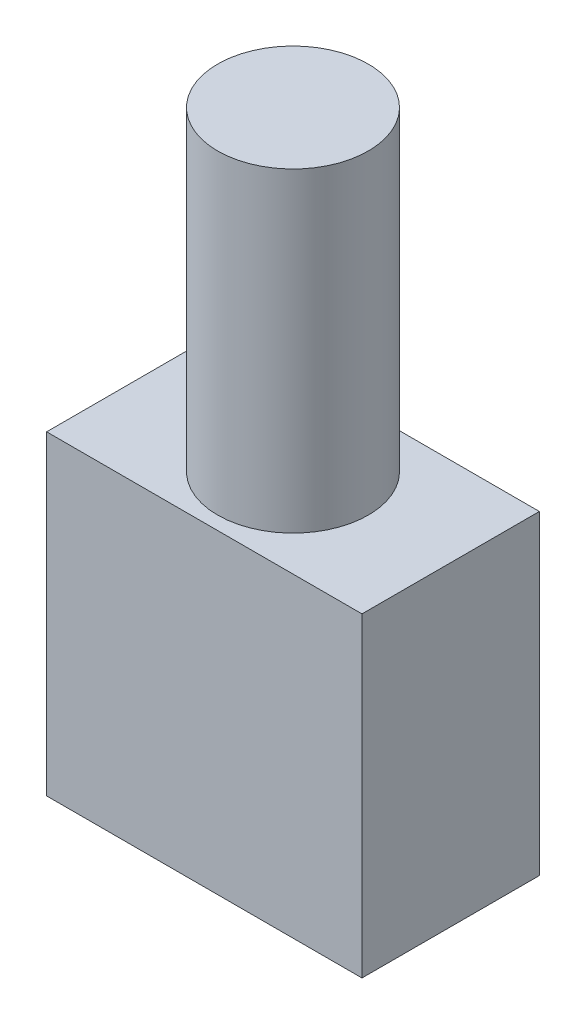
ISO-10303-21;
HEADER;
FILE_DESCRIPTION(('STEP AP214'),'2;1');
FILE_NAME('part.step','',(''),(''),'','','');
FILE_SCHEMA(('AUTOMOTIVE_DESIGN { 1 0 10303 214 1 1 1 1 }'));
ENDSEC;
DATA;
#1=APPLICATION_CONTEXT('core data for automotive mechanical design processes');
#2=APPLICATION_PROTOCOL_DEFINITION('international standard','automotive_design',2000,#1);
#3=PRODUCT_CONTEXT('',#1,'mechanical');
#4=PRODUCT('Part','Part','',(#3));
#5=PRODUCT_RELATED_PRODUCT_CATEGORY('part','',(#4));
#6=PRODUCT_DEFINITION_FORMATION('','',#4);
#7=PRODUCT_DEFINITION_CONTEXT('part definition',#1,'design');
#8=PRODUCT_DEFINITION('design','',#6,#7);
#9=PRODUCT_DEFINITION_SHAPE('','',#8);
#10=(LENGTH_UNIT() NAMED_UNIT(*) SI_UNIT(.MILLI.,.METRE.));
#11=(NAMED_UNIT(*) PLANE_ANGLE_UNIT() SI_UNIT($,.RADIAN.));
#12=(NAMED_UNIT(*) SI_UNIT($,.STERADIAN.) SOLID_ANGLE_UNIT());
#13=UNCERTAINTY_MEASURE_WITH_UNIT(LENGTH_MEASURE(1.E-05),#10,'distance_accuracy_value','');
#14=(GEOMETRIC_REPRESENTATION_CONTEXT(3) GLOBAL_UNCERTAINTY_ASSIGNED_CONTEXT((#13)) GLOBAL_UNIT_ASSIGNED_CONTEXT((#10,
#11,#12)) REPRESENTATION_CONTEXT('',''));
#15=CARTESIAN_POINT('',(0.,0.,0.));
#16=DIRECTION('',(0.,0.,1.));
#17=DIRECTION('',(1.,0.,0.));
#18=AXIS2_PLACEMENT_3D('',#15,#16,#17);
#19=CARTESIAN_POINT('',(-40.,80.,22.5));
#20=DIRECTION('',(0.,0.,-1.));
#21=DIRECTION('',(-1.,0.,0.));
#22=AXIS2_PLACEMENT_3D('',#19,#20,#21);
#23=PLANE('',#22);
#24=DIRECTION('',(1.,0.,0.));
#25=VECTOR('',#24,1.);
#26=CARTESIAN_POINT('',(-40.,0.,22.5));
#27=LINE('',#26,#25);
#28=CARTESIAN_POINT('',(-40.,0.,22.5));
#29=VERTEX_POINT('',#28);
#30=CARTESIAN_POINT('',(40.,0.,22.5));
#31=VERTEX_POINT('',#30);
#32=EDGE_CURVE('E141',#29,#31,#27,.T.);
#33=ORIENTED_EDGE('',*,*,#32,.T.);
#34=DIRECTION('',(0.,-1.,0.));
#35=VECTOR('',#34,1.);
#36=CARTESIAN_POINT('',(40.,80.,22.5));
#37=LINE('',#36,#35);
#38=CARTESIAN_POINT('',(40.,80.,22.5));
#39=VERTEX_POINT('',#38);
#40=EDGE_CURVE('E38',#39,#31,#37,.T.);
#41=ORIENTED_EDGE('',*,*,#40,.F.);
#42=DIRECTION('',(1.,0.,0.));
#43=VECTOR('',#42,1.);
#44=CARTESIAN_POINT('',(-40.,80.,22.5));
#45=LINE('',#44,#43);
#46=CARTESIAN_POINT('',(-40.,80.,22.5));
#47=VERTEX_POINT('',#46);
#48=EDGE_CURVE('E153',#47,#39,#45,.T.);
#49=ORIENTED_EDGE('',*,*,#48,.F.);
#50=DIRECTION('',(0.,-1.,0.));
#51=VECTOR('',#50,1.);
#52=CARTESIAN_POINT('',(-40.,80.,22.5));
#53=LINE('',#52,#51);
#54=EDGE_CURVE('E52',#47,#29,#53,.T.);
#55=ORIENTED_EDGE('',*,*,#54,.T.);
#56=EDGE_LOOP('',(#33,#41,#49,#55));
#57=FACE_BOUND('',#56,.T.);
#58=ADVANCED_FACE('F35',(#57),#23,.F.);
#59=CARTESIAN_POINT('',(40.,80.,22.5));
#60=DIRECTION('',(-1.,0.,0.));
#61=DIRECTION('',(0.,0.,1.));
#62=AXIS2_PLACEMENT_3D('',#59,#60,#61);
#63=PLANE('',#62);
#64=DIRECTION('',(0.,0.,-1.));
#65=VECTOR('',#64,1.);
#66=CARTESIAN_POINT('',(40.,0.,22.5));
#67=LINE('',#66,#65);
#68=CARTESIAN_POINT('',(40.,0.,-22.5));
#69=VERTEX_POINT('',#68);
#70=EDGE_CURVE('E163',#31,#69,#67,.T.);
#71=ORIENTED_EDGE('',*,*,#70,.T.);
#72=DIRECTION('',(0.,-1.,0.));
#73=VECTOR('',#72,1.);
#74=CARTESIAN_POINT('',(40.,80.,-22.5));
#75=LINE('',#74,#73);
#76=CARTESIAN_POINT('',(40.,80.,-22.5));
#77=VERTEX_POINT('',#76);
#78=EDGE_CURVE('E172',#77,#69,#75,.T.);
#79=ORIENTED_EDGE('',*,*,#78,.F.);
#80=DIRECTION('',(0.,0.,-1.));
#81=VECTOR('',#80,1.);
#82=CARTESIAN_POINT('',(40.,80.,22.5));
#83=LINE('',#82,#81);
#84=EDGE_CURVE('E79',#39,#77,#83,.T.);
#85=ORIENTED_EDGE('',*,*,#84,.F.);
#86=ORIENTED_EDGE('',*,*,#40,.T.);
#87=EDGE_LOOP('',(#71,#79,#85,#86));
#88=FACE_BOUND('',#87,.T.);
#89=ADVANCED_FACE('F175',(#88),#63,.F.);
#90=CARTESIAN_POINT('',(-40.,80.,-22.5));
#91=DIRECTION('',(0.,0.,-1.));
#92=DIRECTION('',(-1.,0.,0.));
#93=AXIS2_PLACEMENT_3D('',#90,#91,#92);
#94=PLANE('',#93);
#95=DIRECTION('',(1.,0.,0.));
#96=VECTOR('',#95,1.);
#97=CARTESIAN_POINT('',(-40.,0.,-22.5));
#98=LINE('',#97,#96);
#99=CARTESIAN_POINT('',(-40.,0.,-22.5));
#100=VERTEX_POINT('',#99);
#101=EDGE_CURVE('E166',#100,#69,#98,.T.);
#102=ORIENTED_EDGE('',*,*,#101,.F.);
#103=DIRECTION('',(0.,-1.,0.));
#104=VECTOR('',#103,1.);
#105=CARTESIAN_POINT('',(-40.,80.,-22.5));
#106=LINE('',#105,#104);
#107=CARTESIAN_POINT('',(-40.,80.,-22.5));
#108=VERTEX_POINT('',#107);
#109=EDGE_CURVE('E67',#108,#100,#106,.T.);
#110=ORIENTED_EDGE('',*,*,#109,.F.);
#111=DIRECTION('',(1.,0.,0.));
#112=VECTOR('',#111,1.);
#113=CARTESIAN_POINT('',(-40.,80.,-22.5));
#114=LINE('',#113,#112);
#115=EDGE_CURVE('E157',#108,#77,#114,.T.);
#116=ORIENTED_EDGE('',*,*,#115,.T.);
#117=ORIENTED_EDGE('',*,*,#78,.T.);
#118=EDGE_LOOP('',(#102,#110,#116,#117));
#119=FACE_BOUND('',#118,.T.);
#120=ADVANCED_FACE('F181',(#119),#94,.T.);
#121=CARTESIAN_POINT('',(-40.,80.,22.5));
#122=DIRECTION('',(-1.,0.,0.));
#123=DIRECTION('',(0.,0.,1.));
#124=AXIS2_PLACEMENT_3D('',#121,#122,#123);
#125=PLANE('',#124);
#126=DIRECTION('',(0.,0.,-1.));
#127=VECTOR('',#126,1.);
#128=CARTESIAN_POINT('',(-40.,0.,22.5));
#129=LINE('',#128,#127);
#130=EDGE_CURVE('E155',#29,#100,#129,.T.);
#131=ORIENTED_EDGE('',*,*,#130,.F.);
#132=ORIENTED_EDGE('',*,*,#54,.F.);
#133=DIRECTION('',(0.,0.,-1.));
#134=VECTOR('',#133,1.);
#135=CARTESIAN_POINT('',(-40.,80.,22.5));
#136=LINE('',#135,#134);
#137=EDGE_CURVE('E160',#47,#108,#136,.T.);
#138=ORIENTED_EDGE('',*,*,#137,.T.);
#139=ORIENTED_EDGE('',*,*,#109,.T.);
#140=EDGE_LOOP('',(#131,#132,#138,#139));
#141=FACE_BOUND('',#140,.T.);
#142=ADVANCED_FACE('F178',(#141),#125,.T.);
#143=CARTESIAN_POINT('',(0.,80.,0.));
#144=DIRECTION('',(0.,1.,0.));
#145=DIRECTION('',(0.,0.,1.));
#146=AXIS2_PLACEMENT_3D('',#143,#144,#145);
#147=PLANE('',#146);
#148=CARTESIAN_POINT('',(0.,80.,0.));
#149=DIRECTION('',(0.,1.,0.));
#150=DIRECTION('',(0.,0.,1.));
#151=AXIS2_PLACEMENT_3D('',#148,#149,#150);
#152=CIRCLE('',#151,19.1129029729654);
#153=CARTESIAN_POINT('',(0.,80.,19.1129029729654));
#154=VERTEX_POINT('',#153);
#155=EDGE_CURVE('E11',#154,#154,#152,.T.);
#156=ORIENTED_EDGE('',*,*,#155,.F.);
#157=EDGE_LOOP('',(#156));
#158=FACE_BOUND('',#157,.T.);
#159=ORIENTED_EDGE('',*,*,#48,.T.);
#160=ORIENTED_EDGE('',*,*,#84,.T.);
#161=ORIENTED_EDGE('',*,*,#115,.F.);
#162=ORIENTED_EDGE('',*,*,#137,.F.);
#163=EDGE_LOOP('',(#159,#160,#161,#162));
#164=FACE_BOUND('',#163,.T.);
#165=ADVANCED_FACE('F180',(#158,#164),#147,.T.);
#166=CARTESIAN_POINT('',(0.,0.,0.));
#167=DIRECTION('',(0.,1.,0.));
#168=DIRECTION('',(0.,0.,1.));
#169=AXIS2_PLACEMENT_3D('',#166,#167,#168);
#170=PLANE('',#169);
#171=ORIENTED_EDGE('',*,*,#32,.F.);
#172=ORIENTED_EDGE('',*,*,#130,.T.);
#173=ORIENTED_EDGE('',*,*,#101,.T.);
#174=ORIENTED_EDGE('',*,*,#70,.F.);
#175=EDGE_LOOP('',(#171,#172,#173,#174));
#176=FACE_BOUND('',#175,.T.);
#177=ADVANCED_FACE('F177',(#176),#170,.F.);
#178=CARTESIAN_POINT('',(0.,160.,0.));
#179=DIRECTION('',(0.,-1.,0.));
#180=DIRECTION('',(0.,0.,-1.));
#181=AXIS2_PLACEMENT_3D('',#178,#179,#180);
#182=CYLINDRICAL_SURFACE('',#181,19.1129029729654);
#183=CARTESIAN_POINT('',(0.,160.,0.));
#184=DIRECTION('',(0.,1.,0.));
#185=DIRECTION('',(0.,0.,1.));
#186=AXIS2_PLACEMENT_3D('',#183,#184,#185);
#187=CIRCLE('',#186,19.1129029729654);
#188=CARTESIAN_POINT('',(0.,160.,19.1129029729654));
#189=VERTEX_POINT('',#188);
#190=EDGE_CURVE('E132',#189,#189,#187,.T.);
#191=ORIENTED_EDGE('',*,*,#190,.F.);
#192=EDGE_LOOP('',(#191));
#193=FACE_BOUND('',#192,.T.);
#194=ORIENTED_EDGE('',*,*,#155,.T.);
#195=EDGE_LOOP('',(#194));
#196=FACE_BOUND('',#195,.T.);
#197=ADVANCED_FACE('F215',(#193,#196),#182,.T.);
#198=CARTESIAN_POINT('',(0.,160.,0.));
#199=DIRECTION('',(0.,1.,0.));
#200=DIRECTION('',(0.,0.,1.));
#201=AXIS2_PLACEMENT_3D('',#198,#199,#200);
#202=PLANE('',#201);
#203=ORIENTED_EDGE('',*,*,#190,.T.);
#204=EDGE_LOOP('',(#203));
#205=FACE_BOUND('',#204,.T.);
#206=ADVANCED_FACE('F285',(#205),#202,.T.);
#207=CLOSED_SHELL('',(#58,#89,#120,#142,#165,#177,#197,#206));
#208=CARTESIAN_POINT('',(38.,79.,20.5));
#209=DIRECTION('',(0.998629534754574,-0.0523359562429439,0.));
#210=DIRECTION('',(0.052335956242944,0.998629534754574,0.));
#211=AXIS2_PLACEMENT_3D('',#208,#209,#210);
#212=PLANE('',#211);
#213=DIRECTION('',(0.,0.,-1.));
#214=VECTOR('',#213,1.);
#215=CARTESIAN_POINT('',(38.,79.,20.5));
#216=LINE('',#215,#214);
#217=CARTESIAN_POINT('',(38.,79.,20.5));
#218=VERTEX_POINT('',#217);
#219=CARTESIAN_POINT('',(38.,79.,-20.5));
#220=VERTEX_POINT('',#219);
#221=EDGE_CURVE('E125',#218,#220,#216,.T.);
#222=ORIENTED_EDGE('',*,*,#221,.T.);
#223=DIRECTION('',(0.052264427688714,0.997264688634237,-0.052264427688714));
#224=VECTOR('',#223,1.);
#225=CARTESIAN_POINT('',(37.8880056135332,76.8630198035691,-20.3880056135332));
#226=LINE('',#225,#224);
#227=CARTESIAN_POINT('',(34.4362710087532,11.,-16.9362710087532));
#228=VERTEX_POINT('',#227);
#229=EDGE_CURVE('E107',#228,#220,#226,.T.);
#230=ORIENTED_EDGE('',*,*,#229,.F.);
#231=DIRECTION('',(0.,0.,-1.));
#232=VECTOR('',#231,1.);
#233=CARTESIAN_POINT('',(34.4362710087532,11.,20.5));
#234=LINE('',#233,#232);
#235=CARTESIAN_POINT('',(34.4362710087532,11.,16.9362710087532));
#236=VERTEX_POINT('',#235);
#237=EDGE_CURVE('E140',#236,#228,#234,.T.);
#238=ORIENTED_EDGE('',*,*,#237,.F.);
#239=DIRECTION('',(0.052264427688714,0.997264688634237,0.052264427688714));
#240=VECTOR('',#239,1.);
#241=CARTESIAN_POINT('',(37.7924006494762,75.038768416372,20.2924006494762));
#242=LINE('',#241,#240);
#243=EDGE_CURVE('E131',#236,#218,#242,.T.);
#244=ORIENTED_EDGE('',*,*,#243,.T.);
#245=EDGE_LOOP('',(#222,#230,#238,#244));
#246=FACE_BOUND('',#245,.T.);
#247=ADVANCED_FACE('F130',(#246),#212,.F.);
#248=CARTESIAN_POINT('',(-38.,79.,20.5));
#249=DIRECTION('',(0.,-0.0523359562429439,0.998629534754574));
#250=DIRECTION('',(0.,-0.998629534754574,-0.052335956242944));
#251=AXIS2_PLACEMENT_3D('',#248,#249,#250);
#252=PLANE('',#251);
#253=DIRECTION('',(1.,0.,0.));
#254=VECTOR('',#253,1.);
#255=CARTESIAN_POINT('',(-38.,79.,20.5));
#256=LINE('',#255,#254);
#257=CARTESIAN_POINT('',(-38.,79.,20.5));
#258=VERTEX_POINT('',#257);
#259=EDGE_CURVE('E138',#258,#218,#256,.T.);
#260=ORIENTED_EDGE('',*,*,#259,.T.);
#261=ORIENTED_EDGE('',*,*,#243,.F.);
#262=DIRECTION('',(1.,0.,0.));
#263=VECTOR('',#262,1.);
#264=CARTESIAN_POINT('',(-38.,11.,16.9362710087532));
#265=LINE('',#264,#263);
#266=CARTESIAN_POINT('',(-34.4362710087532,11.,16.9362710087532));
#267=VERTEX_POINT('',#266);
#268=EDGE_CURVE('E118',#267,#236,#265,.T.);
#269=ORIENTED_EDGE('',*,*,#268,.F.);
#270=DIRECTION('',(-0.052264427688714,0.997264688634237,0.052264427688714));
#271=VECTOR('',#270,1.);
#272=CARTESIAN_POINT('',(-38.,79.,20.5));
#273=LINE('',#272,#271);
#274=EDGE_CURVE('E142',#267,#258,#273,.T.);
#275=ORIENTED_EDGE('',*,*,#274,.T.);
#276=EDGE_LOOP('',(#260,#261,#269,#275));
#277=FACE_BOUND('',#276,.T.);
#278=ADVANCED_FACE('F224',(#277),#252,.F.);
#279=CARTESIAN_POINT('',(-38.,79.,20.5));
#280=DIRECTION('',(-0.998629534754574,-0.0523359562429439,0.));
#281=DIRECTION('',(0.052335956242944,-0.998629534754574,0.));
#282=AXIS2_PLACEMENT_3D('',#279,#280,#281);
#283=PLANE('',#282);
#284=DIRECTION('',(0.,0.,1.));
#285=VECTOR('',#284,1.);
#286=CARTESIAN_POINT('',(-38.,79.,20.5));
#287=LINE('',#286,#285);
#288=CARTESIAN_POINT('',(-38.,79.,-20.5));
#289=VERTEX_POINT('',#288);
#290=EDGE_CURVE('E128',#289,#258,#287,.T.);
#291=ORIENTED_EDGE('',*,*,#290,.T.);
#292=ORIENTED_EDGE('',*,*,#274,.F.);
#293=DIRECTION('',(0.,0.,1.));
#294=VECTOR('',#293,1.);
#295=CARTESIAN_POINT('',(-34.4362710087532,11.,20.5));
#296=LINE('',#295,#294);
#297=CARTESIAN_POINT('',(-34.4362710087532,11.,-16.9362710087532));
#298=VERTEX_POINT('',#297);
#299=EDGE_CURVE('E149',#298,#267,#296,.T.);
#300=ORIENTED_EDGE('',*,*,#299,.F.);
#301=DIRECTION('',(-0.052264427688714,0.997264688634237,-0.052264427688714));
#302=VECTOR('',#301,1.);
#303=CARTESIAN_POINT('',(-38.,79.,-20.5));
#304=LINE('',#303,#302);
#305=EDGE_CURVE('E117',#298,#289,#304,.T.);
#306=ORIENTED_EDGE('',*,*,#305,.T.);
#307=EDGE_LOOP('',(#291,#292,#300,#306));
#308=FACE_BOUND('',#307,.T.);
#309=ADVANCED_FACE('F235',(#308),#283,.F.);
#310=CARTESIAN_POINT('',(-38.,79.,-20.5));
#311=DIRECTION('',(0.,-0.0523359562429439,-0.998629534754574));
#312=DIRECTION('',(0.,0.998629534754574,-0.052335956242944));
#313=AXIS2_PLACEMENT_3D('',#310,#311,#312);
#314=PLANE('',#313);
#315=DIRECTION('',(-1.,0.,0.));
#316=VECTOR('',#315,1.);
#317=CARTESIAN_POINT('',(-38.,79.,-20.5));
#318=LINE('',#317,#316);
#319=EDGE_CURVE('E110',#220,#289,#318,.T.);
#320=ORIENTED_EDGE('',*,*,#319,.T.);
#321=ORIENTED_EDGE('',*,*,#305,.F.);
#322=DIRECTION('',(-1.,0.,0.));
#323=VECTOR('',#322,1.);
#324=CARTESIAN_POINT('',(-38.,11.,-16.9362710087532));
#325=LINE('',#324,#323);
#326=EDGE_CURVE('E112',#228,#298,#325,.T.);
#327=ORIENTED_EDGE('',*,*,#326,.F.);
#328=ORIENTED_EDGE('',*,*,#229,.T.);
#329=EDGE_LOOP('',(#320,#321,#327,#328));
#330=FACE_BOUND('',#329,.T.);
#331=ADVANCED_FACE('F109',(#330),#314,.F.);
#332=CARTESIAN_POINT('',(0.,11.,0.));
#333=DIRECTION('',(0.,-1.,0.));
#334=DIRECTION('',(0.,0.,-1.));
#335=AXIS2_PLACEMENT_3D('',#332,#333,#334);
#336=PLANE('',#335);
#337=ORIENTED_EDGE('',*,*,#237,.T.);
#338=ORIENTED_EDGE('',*,*,#326,.T.);
#339=ORIENTED_EDGE('',*,*,#299,.T.);
#340=ORIENTED_EDGE('',*,*,#268,.T.);
#341=EDGE_LOOP('',(#337,#338,#339,#340));
#342=FACE_BOUND('',#341,.T.);
#343=ADVANCED_FACE('F254',(#342),#336,.F.);
#344=CARTESIAN_POINT('',(0.,79.,0.));
#345=DIRECTION('',(0.,-1.,0.));
#346=DIRECTION('',(0.,0.,-1.));
#347=AXIS2_PLACEMENT_3D('',#344,#345,#346);
#348=PLANE('',#347);
#349=ORIENTED_EDGE('',*,*,#221,.F.);
#350=ORIENTED_EDGE('',*,*,#259,.F.);
#351=ORIENTED_EDGE('',*,*,#290,.F.);
#352=ORIENTED_EDGE('',*,*,#319,.F.);
#353=EDGE_LOOP('',(#349,#350,#351,#352));
#354=FACE_BOUND('',#353,.T.);
#355=ADVANCED_FACE('F123',(#354),#348,.T.);
#356=CLOSED_SHELL('',(#247,#278,#309,#331,#343,#355));
#357=ORIENTED_CLOSED_SHELL('',*,#356,.T.);
#358=BREP_WITH_VOIDS('B2',#207,(#357));
#359=ADVANCED_BREP_SHAPE_REPRESENTATION('',(#18,#358),#14);
#360=SHAPE_DEFINITION_REPRESENTATION(#9,#359);
ENDSEC;
END-ISO-10303-21;
